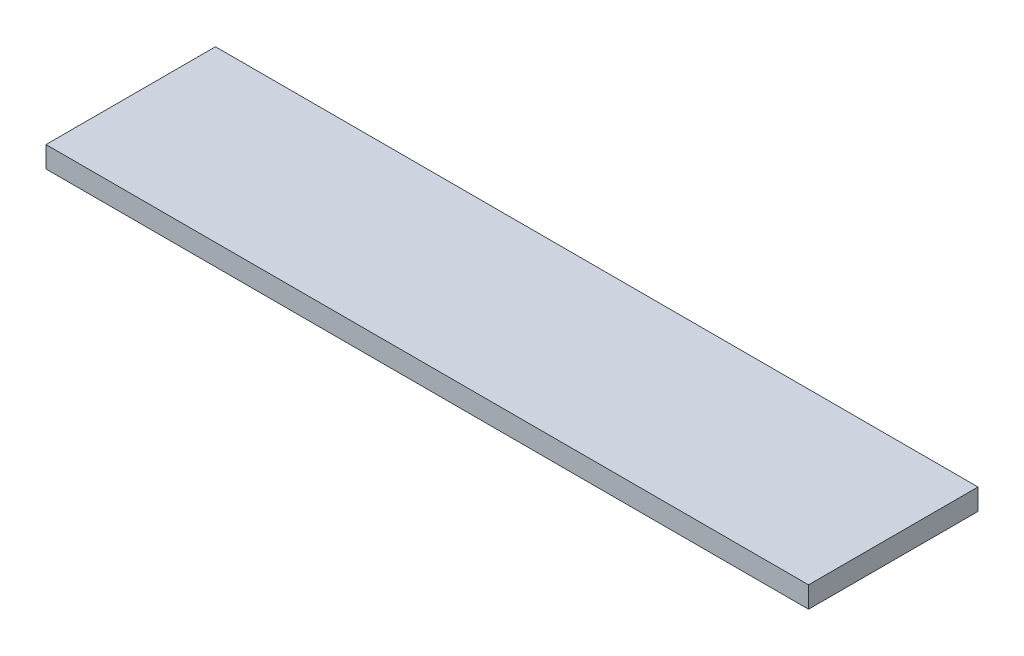
ISO-10303-21;
HEADER;
FILE_DESCRIPTION(('STEP AP214'),'2;1');
FILE_NAME('part.step','',(''),(''),'','','');
FILE_SCHEMA(('AUTOMOTIVE_DESIGN { 1 0 10303 214 1 1 1 1 }'));
ENDSEC;
DATA;
#1=APPLICATION_CONTEXT('core data for automotive mechanical design processes');
#2=APPLICATION_PROTOCOL_DEFINITION('international standard','automotive_design',2000,#1);
#3=PRODUCT_CONTEXT('',#1,'mechanical');
#4=PRODUCT('Part','Part','',(#3));
#5=PRODUCT_RELATED_PRODUCT_CATEGORY('part','',(#4));
#6=PRODUCT_DEFINITION_FORMATION('','',#4);
#7=PRODUCT_DEFINITION_CONTEXT('part definition',#1,'design');
#8=PRODUCT_DEFINITION('design','',#6,#7);
#9=PRODUCT_DEFINITION_SHAPE('','',#8);
#10=(LENGTH_UNIT() NAMED_UNIT(*) SI_UNIT(.MILLI.,.METRE.));
#11=(NAMED_UNIT(*) PLANE_ANGLE_UNIT() SI_UNIT($,.RADIAN.));
#12=(NAMED_UNIT(*) SI_UNIT($,.STERADIAN.) SOLID_ANGLE_UNIT());
#13=UNCERTAINTY_MEASURE_WITH_UNIT(LENGTH_MEASURE(1.E-05),#10,'distance_accuracy_value','');
#14=(GEOMETRIC_REPRESENTATION_CONTEXT(3) GLOBAL_UNCERTAINTY_ASSIGNED_CONTEXT((#13)) GLOBAL_UNIT_ASSIGNED_CONTEXT((#10,
#11,#12)) REPRESENTATION_CONTEXT('',''));
#15=CARTESIAN_POINT('',(0.,0.,0.));
#16=DIRECTION('',(0.,0.,1.));
#17=DIRECTION('',(1.,0.,0.));
#18=AXIS2_PLACEMENT_3D('',#15,#16,#17);
#19=CARTESIAN_POINT('',(90.,5.,-20.));
#20=DIRECTION('',(-1.,0.,0.));
#21=DIRECTION('',(0.,0.,1.));
#22=AXIS2_PLACEMENT_3D('',#19,#20,#21);
#23=PLANE('',#22);
#24=DIRECTION('',(0.,0.,-1.));
#25=VECTOR('',#24,1.);
#26=CARTESIAN_POINT('',(90.,0.,-20.));
#27=LINE('',#26,#25);
#28=CARTESIAN_POINT('',(90.,0.,20.));
#29=VERTEX_POINT('',#28);
#30=CARTESIAN_POINT('',(90.,0.,-20.));
#31=VERTEX_POINT('',#30);
#32=EDGE_CURVE('E96',#29,#31,#27,.T.);
#33=ORIENTED_EDGE('',*,*,#32,.T.);
#34=DIRECTION('',(0.,-1.,0.));
#35=VECTOR('',#34,1.);
#36=CARTESIAN_POINT('',(90.,5.,-20.));
#37=LINE('',#36,#35);
#38=CARTESIAN_POINT('',(90.,5.,-20.));
#39=VERTEX_POINT('',#38);
#40=EDGE_CURVE('E11',#39,#31,#37,.T.);
#41=ORIENTED_EDGE('',*,*,#40,.F.);
#42=DIRECTION('',(0.,0.,-1.));
#43=VECTOR('',#42,1.);
#44=CARTESIAN_POINT('',(90.,5.,-20.));
#45=LINE('',#44,#43);
#46=CARTESIAN_POINT('',(90.,5.,20.));
#47=VERTEX_POINT('',#46);
#48=EDGE_CURVE('E84',#47,#39,#45,.T.);
#49=ORIENTED_EDGE('',*,*,#48,.F.);
#50=DIRECTION('',(0.,-1.,0.));
#51=VECTOR('',#50,1.);
#52=CARTESIAN_POINT('',(90.,5.,20.));
#53=LINE('',#52,#51);
#54=EDGE_CURVE('E92',#47,#29,#53,.T.);
#55=ORIENTED_EDGE('',*,*,#54,.T.);
#56=EDGE_LOOP('',(#33,#41,#49,#55));
#57=FACE_BOUND('',#56,.T.);
#58=ADVANCED_FACE('F33',(#57),#23,.F.);
#59=CARTESIAN_POINT('',(-90.,5.,-20.));
#60=DIRECTION('',(0.,0.,1.));
#61=DIRECTION('',(1.,0.,0.));
#62=AXIS2_PLACEMENT_3D('',#59,#60,#61);
#63=PLANE('',#62);
#64=DIRECTION('',(-1.,0.,0.));
#65=VECTOR('',#64,1.);
#66=CARTESIAN_POINT('',(-90.,0.,-20.));
#67=LINE('',#66,#65);
#68=CARTESIAN_POINT('',(-90.,0.,-20.));
#69=VERTEX_POINT('',#68);
#70=EDGE_CURVE('E88',#31,#69,#67,.T.);
#71=ORIENTED_EDGE('',*,*,#70,.T.);
#72=DIRECTION('',(0.,-1.,0.));
#73=VECTOR('',#72,1.);
#74=CARTESIAN_POINT('',(-90.,5.,-20.));
#75=LINE('',#74,#73);
#76=CARTESIAN_POINT('',(-90.,5.,-20.));
#77=VERTEX_POINT('',#76);
#78=EDGE_CURVE('E41',#77,#69,#75,.T.);
#79=ORIENTED_EDGE('',*,*,#78,.F.);
#80=DIRECTION('',(-1.,0.,0.));
#81=VECTOR('',#80,1.);
#82=CARTESIAN_POINT('',(-90.,5.,-20.));
#83=LINE('',#82,#81);
#84=EDGE_CURVE('E79',#39,#77,#83,.T.);
#85=ORIENTED_EDGE('',*,*,#84,.F.);
#86=ORIENTED_EDGE('',*,*,#40,.T.);
#87=EDGE_LOOP('',(#71,#79,#85,#86));
#88=FACE_BOUND('',#87,.T.);
#89=ADVANCED_FACE('F87',(#88),#63,.F.);
#90=CARTESIAN_POINT('',(-90.,5.,-20.));
#91=DIRECTION('',(1.,0.,0.));
#92=DIRECTION('',(0.,0.,-1.));
#93=AXIS2_PLACEMENT_3D('',#90,#91,#92);
#94=PLANE('',#93);
#95=DIRECTION('',(0.,0.,1.));
#96=VECTOR('',#95,1.);
#97=CARTESIAN_POINT('',(-90.,0.,-20.));
#98=LINE('',#97,#96);
#99=CARTESIAN_POINT('',(-90.,0.,20.));
#100=VERTEX_POINT('',#99);
#101=EDGE_CURVE('E66',#69,#100,#98,.T.);
#102=ORIENTED_EDGE('',*,*,#101,.T.);
#103=DIRECTION('',(0.,-1.,0.));
#104=VECTOR('',#103,1.);
#105=CARTESIAN_POINT('',(-90.,5.,20.));
#106=LINE('',#105,#104);
#107=CARTESIAN_POINT('',(-90.,5.,20.));
#108=VERTEX_POINT('',#107);
#109=EDGE_CURVE('E89',#108,#100,#106,.T.);
#110=ORIENTED_EDGE('',*,*,#109,.F.);
#111=DIRECTION('',(0.,0.,1.));
#112=VECTOR('',#111,1.);
#113=CARTESIAN_POINT('',(-90.,5.,-20.));
#114=LINE('',#113,#112);
#115=EDGE_CURVE('E82',#77,#108,#114,.T.);
#116=ORIENTED_EDGE('',*,*,#115,.F.);
#117=ORIENTED_EDGE('',*,*,#78,.T.);
#118=EDGE_LOOP('',(#102,#110,#116,#117));
#119=FACE_BOUND('',#118,.T.);
#120=ADVANCED_FACE('F90',(#119),#94,.F.);
#121=CARTESIAN_POINT('',(-90.,5.,20.));
#122=DIRECTION('',(0.,0.,-1.));
#123=DIRECTION('',(-1.,0.,0.));
#124=AXIS2_PLACEMENT_3D('',#121,#122,#123);
#125=PLANE('',#124);
#126=DIRECTION('',(1.,0.,0.));
#127=VECTOR('',#126,1.);
#128=CARTESIAN_POINT('',(-90.,0.,20.));
#129=LINE('',#128,#127);
#130=EDGE_CURVE('E72',#100,#29,#129,.T.);
#131=ORIENTED_EDGE('',*,*,#130,.T.);
#132=ORIENTED_EDGE('',*,*,#54,.F.);
#133=DIRECTION('',(1.,0.,0.));
#134=VECTOR('',#133,1.);
#135=CARTESIAN_POINT('',(-90.,5.,20.));
#136=LINE('',#135,#134);
#137=EDGE_CURVE('E49',#108,#47,#136,.T.);
#138=ORIENTED_EDGE('',*,*,#137,.F.);
#139=ORIENTED_EDGE('',*,*,#109,.T.);
#140=EDGE_LOOP('',(#131,#132,#138,#139));
#141=FACE_BOUND('',#140,.T.);
#142=ADVANCED_FACE('F103',(#141),#125,.F.);
#143=CARTESIAN_POINT('',(0.,5.,0.));
#144=DIRECTION('',(0.,1.,0.));
#145=DIRECTION('',(0.,0.,1.));
#146=AXIS2_PLACEMENT_3D('',#143,#144,#145);
#147=PLANE('',#146);
#148=ORIENTED_EDGE('',*,*,#48,.T.);
#149=ORIENTED_EDGE('',*,*,#84,.T.);
#150=ORIENTED_EDGE('',*,*,#115,.T.);
#151=ORIENTED_EDGE('',*,*,#137,.T.);
#152=EDGE_LOOP('',(#148,#149,#150,#151));
#153=FACE_BOUND('',#152,.T.);
#154=ADVANCED_FACE('F80',(#153),#147,.T.);
#155=CARTESIAN_POINT('',(0.,0.,0.));
#156=DIRECTION('',(0.,1.,0.));
#157=DIRECTION('',(0.,0.,1.));
#158=AXIS2_PLACEMENT_3D('',#155,#156,#157);
#159=PLANE('',#158);
#160=ORIENTED_EDGE('',*,*,#32,.F.);
#161=ORIENTED_EDGE('',*,*,#130,.F.);
#162=ORIENTED_EDGE('',*,*,#101,.F.);
#163=ORIENTED_EDGE('',*,*,#70,.F.);
#164=EDGE_LOOP('',(#160,#161,#162,#163));
#165=FACE_BOUND('',#164,.T.);
#166=ADVANCED_FACE('F106',(#165),#159,.F.);
#167=CLOSED_SHELL('',(#58,#89,#120,#142,#154,#166));
#168=MANIFOLD_SOLID_BREP('B2',#167);
#169=ADVANCED_BREP_SHAPE_REPRESENTATION('',(#18,#168),#14);
#170=SHAPE_DEFINITION_REPRESENTATION(#9,#169);
ENDSEC;
END-ISO-10303-21;
